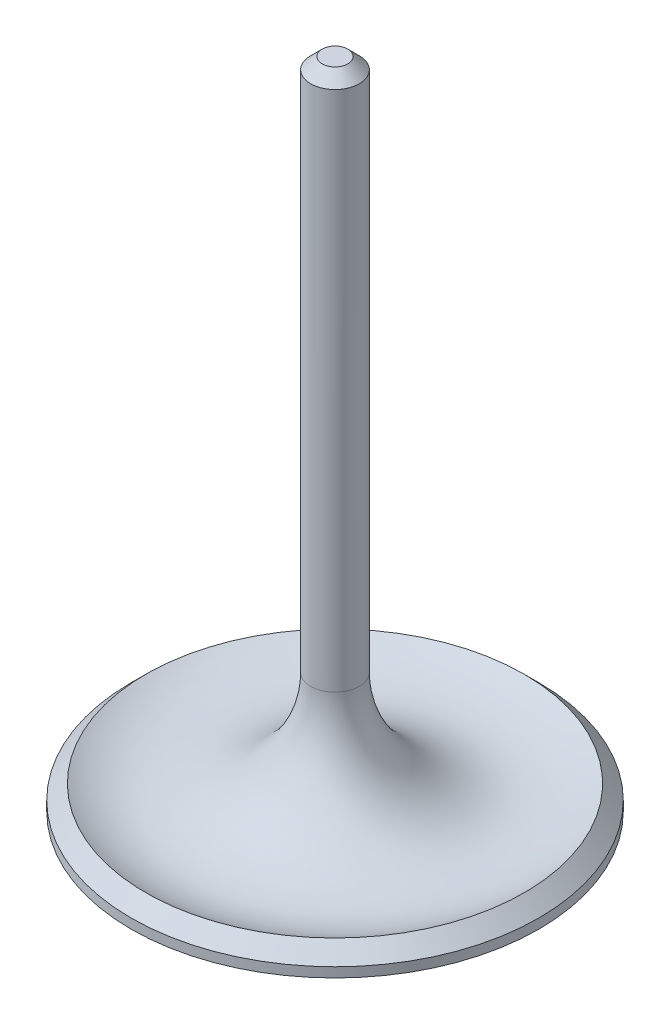
ISO-10303-21;
HEADER;
FILE_DESCRIPTION(('STEP AP214'),'2;1');
FILE_NAME('part.step','',(''),(''),'','','');
FILE_SCHEMA(('AUTOMOTIVE_DESIGN { 1 0 10303 214 1 1 1 1 }'));
ENDSEC;
DATA;
#1=APPLICATION_CONTEXT('core data for automotive mechanical design processes');
#2=APPLICATION_PROTOCOL_DEFINITION('international standard','automotive_design',2000,#1);
#3=PRODUCT_CONTEXT('',#1,'mechanical');
#4=PRODUCT('Part','Part','',(#3));
#5=PRODUCT_RELATED_PRODUCT_CATEGORY('part','',(#4));
#6=PRODUCT_DEFINITION_FORMATION('','',#4);
#7=PRODUCT_DEFINITION_CONTEXT('part definition',#1,'design');
#8=PRODUCT_DEFINITION('design','',#6,#7);
#9=PRODUCT_DEFINITION_SHAPE('','',#8);
#10=(LENGTH_UNIT() NAMED_UNIT(*) SI_UNIT(.MILLI.,.METRE.));
#11=(NAMED_UNIT(*) PLANE_ANGLE_UNIT() SI_UNIT($,.RADIAN.));
#12=(NAMED_UNIT(*) SI_UNIT($,.STERADIAN.) SOLID_ANGLE_UNIT());
#13=UNCERTAINTY_MEASURE_WITH_UNIT(LENGTH_MEASURE(1.E-05),#10,'distance_accuracy_value','');
#14=(GEOMETRIC_REPRESENTATION_CONTEXT(3) GLOBAL_UNCERTAINTY_ASSIGNED_CONTEXT((#13)) GLOBAL_UNIT_ASSIGNED_CONTEXT((#10,
#11,#12)) REPRESENTATION_CONTEXT('',''));
#15=CARTESIAN_POINT('',(0.,0.,0.));
#16=DIRECTION('',(0.,0.,1.));
#17=DIRECTION('',(1.,0.,0.));
#18=AXIS2_PLACEMENT_3D('',#15,#16,#17);
#19=CARTESIAN_POINT('',(0.,0.,0.));
#20=DIRECTION('',(0.,-1.,0.));
#21=DIRECTION('',(0.,0.,-1.));
#22=AXIS2_PLACEMENT_3D('',#19,#20,#21);
#23=PLANE('',#22);
#24=CARTESIAN_POINT('',(0.,0.,0.));
#25=DIRECTION('',(0.,-1.,0.));
#26=DIRECTION('',(0.,0.,-1.));
#27=AXIS2_PLACEMENT_3D('',#24,#25,#26);
#28=CIRCLE('',#27,26.67);
#29=CARTESIAN_POINT('',(0.,0.,-26.67));
#30=VERTEX_POINT('',#29);
#31=EDGE_CURVE('E51',#30,#30,#28,.T.);
#32=ORIENTED_EDGE('',*,*,#31,.T.);
#33=EDGE_LOOP('',(#32));
#34=FACE_BOUND('',#33,.T.);
#35=ADVANCED_FACE('F39',(#34),#23,.T.);
#36=CARTESIAN_POINT('',(0.,0.,0.));
#37=DIRECTION('',(0.,-1.,0.));
#38=DIRECTION('',(0.,0.,-1.));
#39=AXIS2_PLACEMENT_3D('',#36,#37,#38);
#40=CYLINDRICAL_SURFACE('',#39,26.67);
#41=CARTESIAN_POINT('',(0.,1.27,0.));
#42=DIRECTION('',(0.,-1.,0.));
#43=DIRECTION('',(0.,0.,-1.));
#44=AXIS2_PLACEMENT_3D('',#41,#42,#43);
#45=CIRCLE('',#44,26.67);
#46=CARTESIAN_POINT('',(0.,1.27,-26.67));
#47=VERTEX_POINT('',#46);
#48=EDGE_CURVE('E55',#47,#47,#45,.T.);
#49=ORIENTED_EDGE('',*,*,#48,.T.);
#50=EDGE_LOOP('',(#49));
#51=FACE_BOUND('',#50,.T.);
#52=ORIENTED_EDGE('',*,*,#31,.F.);
#53=EDGE_LOOP('',(#52));
#54=FACE_BOUND('',#53,.T.);
#55=ADVANCED_FACE('F82',(#51,#54),#40,.T.);
#56=CARTESIAN_POINT('',(0.,1.27,0.));
#57=DIRECTION('',(0.,-1.,0.));
#58=DIRECTION('',(0.,0.,-1.));
#59=AXIS2_PLACEMENT_3D('',#56,#57,#58);
#60=CONICAL_SURFACE('',#59,26.67,0.785398163397454);
#61=CARTESIAN_POINT('',(0.,3.18,0.));
#62=DIRECTION('',(0.,-1.,0.));
#63=DIRECTION('',(0.,0.,-1.));
#64=AXIS2_PLACEMENT_3D('',#61,#62,#63);
#65=CIRCLE('',#64,24.76);
#66=CARTESIAN_POINT('',(0.,3.18,-24.76));
#67=VERTEX_POINT('',#66);
#68=EDGE_CURVE('E60',#67,#67,#65,.T.);
#69=ORIENTED_EDGE('',*,*,#68,.T.);
#70=EDGE_LOOP('',(#69));
#71=FACE_BOUND('',#70,.T.);
#72=ORIENTED_EDGE('',*,*,#48,.F.);
#73=EDGE_LOOP('',(#72));
#74=FACE_BOUND('',#73,.T.);
#75=ADVANCED_FACE('F79',(#71,#74),#60,.T.);
#76=CARTESIAN_POINT('',(0.,15.7660753047215,0.));
#77=DIRECTION('',(0.,-1.,0.));
#78=DIRECTION('',(0.,0.,-1.));
#79=AXIS2_PLACEMENT_3D('',#76,#77,#78);
#80=TOROIDAL_SURFACE('',#79,17.640280157,14.460280157);
#81=CARTESIAN_POINT('',(0.,15.7660753047215,0.));
#82=DIRECTION('',(0.,-1.,0.));
#83=DIRECTION('',(0.,0.,-1.));
#84=AXIS2_PLACEMENT_3D('',#81,#82,#83);
#85=CIRCLE('',#84,3.18000000000001);
#86=CARTESIAN_POINT('',(0.,15.7660753047215,-3.18000000000001));
#87=VERTEX_POINT('',#86);
#88=EDGE_CURVE('E63',#87,#87,#85,.T.);
#89=ORIENTED_EDGE('',*,*,#88,.T.);
#90=EDGE_LOOP('',(#89));
#91=FACE_BOUND('',#90,.T.);
#92=ORIENTED_EDGE('',*,*,#68,.F.);
#93=EDGE_LOOP('',(#92));
#94=FACE_BOUND('',#93,.T.);
#95=ADVANCED_FACE('F67',(#91,#94),#80,.F.);
#96=CARTESIAN_POINT('',(0.,0.,0.));
#97=DIRECTION('',(0.,-1.,0.));
#98=DIRECTION('',(0.,0.,-1.));
#99=AXIS2_PLACEMENT_3D('',#96,#97,#98);
#100=CYLINDRICAL_SURFACE('',#99,3.18);
#101=CARTESIAN_POINT('',(0.,84.05,0.));
#102=DIRECTION('',(0.,1.,0.));
#103=DIRECTION('',(0.,0.,1.));
#104=AXIS2_PLACEMENT_3D('',#101,#102,#103);
#105=CIRCLE('',#104,3.18);
#106=CARTESIAN_POINT('',(0.,84.05,3.18));
#107=VERTEX_POINT('',#106);
#108=EDGE_CURVE('E47',#107,#107,#105,.F.);
#109=ORIENTED_EDGE('',*,*,#108,.T.);
#110=EDGE_LOOP('',(#109));
#111=FACE_BOUND('',#110,.T.);
#112=ORIENTED_EDGE('',*,*,#88,.F.);
#113=EDGE_LOOP('',(#112));
#114=FACE_BOUND('',#113,.T.);
#115=ADVANCED_FACE('F70',(#111,#114),#100,.T.);
#116=CARTESIAN_POINT('',(0.,85.55,0.));
#117=DIRECTION('',(0.,1.,0.));
#118=DIRECTION('',(0.,0.,1.));
#119=AXIS2_PLACEMENT_3D('',#116,#117,#118);
#120=PLANE('',#119);
#121=CARTESIAN_POINT('',(0.,85.55,0.));
#122=DIRECTION('',(0.,1.,0.));
#123=DIRECTION('',(0.,0.,1.));
#124=AXIS2_PLACEMENT_3D('',#121,#122,#123);
#125=CIRCLE('',#124,1.67999999999999);
#126=CARTESIAN_POINT('',(0.,85.55,1.67999999999999));
#127=VERTEX_POINT('',#126);
#128=EDGE_CURVE('E10',#127,#127,#125,.T.);
#129=ORIENTED_EDGE('',*,*,#128,.T.);
#130=EDGE_LOOP('',(#129));
#131=FACE_BOUND('',#130,.T.);
#132=ADVANCED_FACE('F72',(#131),#120,.T.);
#133=CARTESIAN_POINT('',(0.,84.05,0.));
#134=DIRECTION('',(0.,-1.,0.));
#135=DIRECTION('',(0.,0.,-1.));
#136=AXIS2_PLACEMENT_3D('',#133,#134,#135);
#137=CONICAL_SURFACE('',#136,3.18,0.785398163397449);
#138=ORIENTED_EDGE('',*,*,#128,.F.);
#139=EDGE_LOOP('',(#138));
#140=FACE_BOUND('',#139,.T.);
#141=ORIENTED_EDGE('',*,*,#108,.F.);
#142=EDGE_LOOP('',(#141));
#143=FACE_BOUND('',#142,.T.);
#144=ADVANCED_FACE('F42',(#140,#143),#137,.T.);
#145=CLOSED_SHELL('',(#35,#55,#75,#95,#115,#132,#144));
#146=MANIFOLD_SOLID_BREP('B2',#145);
#147=ADVANCED_BREP_SHAPE_REPRESENTATION('',(#18,#146),#14);
#148=SHAPE_DEFINITION_REPRESENTATION(#9,#147);
ENDSEC;
END-ISO-10303-21;
